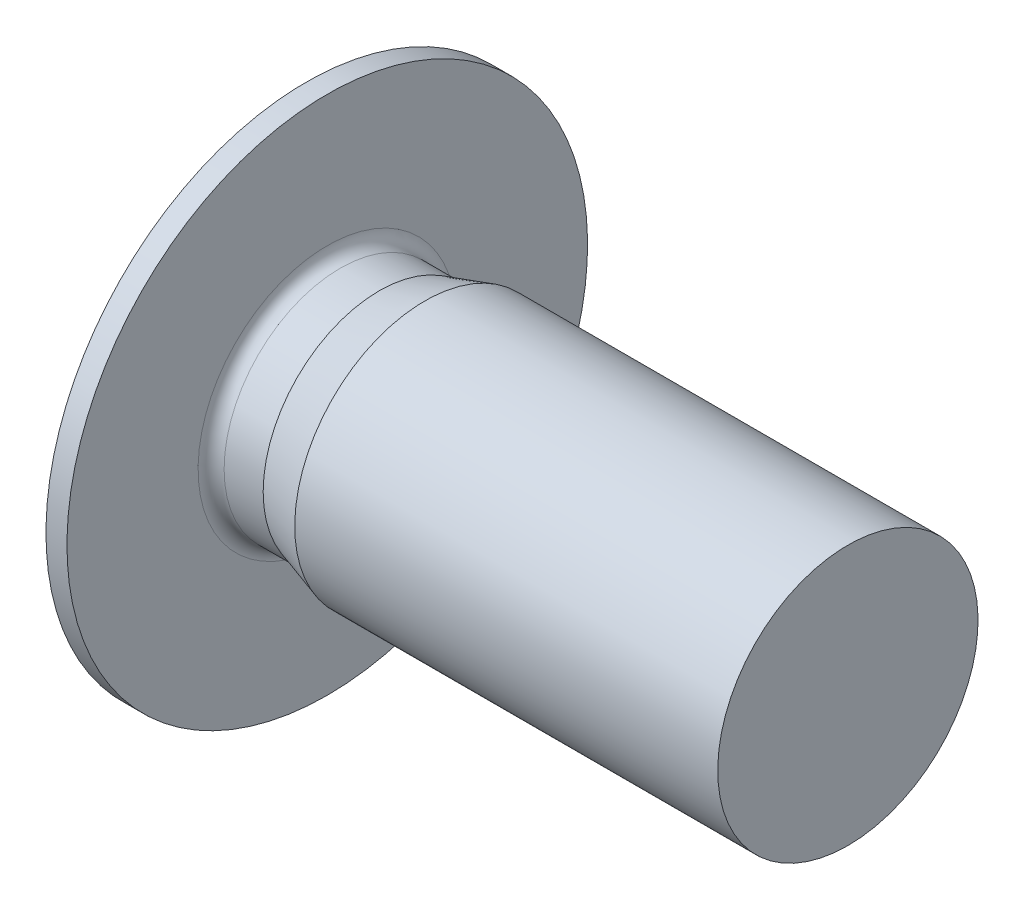
ISO-10303-21;
HEADER;
FILE_DESCRIPTION(('STEP AP214'),'2;1');
FILE_NAME('part.step','',(''),(''),'','','');
FILE_SCHEMA(('AUTOMOTIVE_DESIGN { 1 0 10303 214 1 1 1 1 }'));
ENDSEC;
DATA;
#1=APPLICATION_CONTEXT('core data for automotive mechanical design processes');
#2=APPLICATION_PROTOCOL_DEFINITION('international standard','automotive_design',2000,#1);
#3=PRODUCT_CONTEXT('',#1,'mechanical');
#4=PRODUCT('Part','Part','',(#3));
#5=PRODUCT_RELATED_PRODUCT_CATEGORY('part','',(#4));
#6=PRODUCT_DEFINITION_FORMATION('','',#4);
#7=PRODUCT_DEFINITION_CONTEXT('part definition',#1,'design');
#8=PRODUCT_DEFINITION('design','',#6,#7);
#9=PRODUCT_DEFINITION_SHAPE('','',#8);
#10=(LENGTH_UNIT() NAMED_UNIT(*) SI_UNIT(.MILLI.,.METRE.));
#11=(NAMED_UNIT(*) PLANE_ANGLE_UNIT() SI_UNIT($,.RADIAN.));
#12=(NAMED_UNIT(*) SI_UNIT($,.STERADIAN.) SOLID_ANGLE_UNIT());
#13=UNCERTAINTY_MEASURE_WITH_UNIT(LENGTH_MEASURE(1.E-05),#10,'distance_accuracy_value','');
#14=(GEOMETRIC_REPRESENTATION_CONTEXT(3) GLOBAL_UNCERTAINTY_ASSIGNED_CONTEXT((#13)) GLOBAL_UNIT_ASSIGNED_CONTEXT((#10,
#11,#12)) REPRESENTATION_CONTEXT('',''));
#15=CARTESIAN_POINT('',(0.,0.,0.));
#16=DIRECTION('',(0.,0.,1.));
#17=DIRECTION('',(1.,0.,0.));
#18=AXIS2_PLACEMENT_3D('',#15,#16,#17);
#19=CARTESIAN_POINT('',(1.6,0.,0.));
#20=DIRECTION('',(-1.,0.,0.));
#21=DIRECTION('',(0.,0.,1.));
#22=AXIS2_PLACEMENT_3D('',#19,#20,#21);
#23=PLANE('',#22);
#24=CARTESIAN_POINT('',(1.6,0.,0.));
#25=DIRECTION('',(-1.,0.,0.));
#26=DIRECTION('',(0.,-1.,0.));
#27=AXIS2_PLACEMENT_3D('',#24,#25,#26);
#28=CIRCLE('',#27,1.);
#29=CARTESIAN_POINT('',(1.6,-0.866025403784439,0.5));
#30=VERTEX_POINT('',#29);
#31=CARTESIAN_POINT('',(1.6,0.,1.));
#32=VERTEX_POINT('',#31);
#33=EDGE_CURVE('E55',#30,#32,#28,.T.);
#34=ORIENTED_EDGE('',*,*,#33,.F.);
#35=DIRECTION('',(0.,0.5,0.866025403784439));
#36=VECTOR('',#35,1.);
#37=CARTESIAN_POINT('',(1.6,-1.15470053837925,0.));
#38=LINE('',#37,#36);
#39=CARTESIAN_POINT('',(1.6,-0.577350269189627,1.));
#40=VERTEX_POINT('',#39);
#41=EDGE_CURVE('E270',#30,#40,#38,.T.);
#42=ORIENTED_EDGE('',*,*,#41,.T.);
#43=DIRECTION('',(0.,1.,0.));
#44=VECTOR('',#43,1.);
#45=CARTESIAN_POINT('',(1.6,-0.577350269189627,1.));
#46=LINE('',#45,#44);
#47=EDGE_CURVE('E238',#40,#32,#46,.T.);
#48=ORIENTED_EDGE('',*,*,#47,.T.);
#49=EDGE_LOOP('',(#34,#42,#48));
#50=FACE_BOUND('',#49,.T.);
#51=ADVANCED_FACE('F44',(#50),#23,.T.);
#52=CARTESIAN_POINT('',(1.6,0.866025403784439,0.5));
#53=VERTEX_POINT('',#52);
#54=EDGE_CURVE('E11',#32,#53,#28,.T.);
#55=ORIENTED_EDGE('',*,*,#54,.F.);
#56=CARTESIAN_POINT('',(1.6,0.577350269189626,1.));
#57=VERTEX_POINT('',#56);
#58=EDGE_CURVE('E263',#32,#57,#46,.T.);
#59=ORIENTED_EDGE('',*,*,#58,.T.);
#60=DIRECTION('',(0.,0.5,-0.866025403784439));
#61=VECTOR('',#60,1.);
#62=CARTESIAN_POINT('',(1.6,0.577350269189626,1.));
#63=LINE('',#62,#61);
#64=EDGE_CURVE('E284',#57,#53,#63,.T.);
#65=ORIENTED_EDGE('',*,*,#64,.T.);
#66=EDGE_LOOP('',(#55,#59,#65));
#67=FACE_BOUND('',#66,.T.);
#68=ADVANCED_FACE('F131',(#67),#23,.T.);
#69=CARTESIAN_POINT('',(1.6,0.866025403784439,-0.5));
#70=VERTEX_POINT('',#69);
#71=EDGE_CURVE('E53',#53,#70,#28,.T.);
#72=ORIENTED_EDGE('',*,*,#71,.F.);
#73=CARTESIAN_POINT('',(1.6,1.15470053837925,0.));
#74=VERTEX_POINT('',#73);
#75=EDGE_CURVE('E251',#53,#74,#63,.T.);
#76=ORIENTED_EDGE('',*,*,#75,.T.);
#77=DIRECTION('',(0.,-0.5,-0.866025403784439));
#78=VECTOR('',#77,1.);
#79=CARTESIAN_POINT('',(1.6,1.15470053837925,0.));
#80=LINE('',#79,#78);
#81=EDGE_CURVE('E281',#74,#70,#80,.T.);
#82=ORIENTED_EDGE('',*,*,#81,.T.);
#83=EDGE_LOOP('',(#72,#76,#82));
#84=FACE_BOUND('',#83,.T.);
#85=ADVANCED_FACE('F136',(#84),#23,.T.);
#86=CARTESIAN_POINT('',(1.6,0.,-1.));
#87=VERTEX_POINT('',#86);
#88=EDGE_CURVE('E229',#70,#87,#28,.T.);
#89=ORIENTED_EDGE('',*,*,#88,.F.);
#90=CARTESIAN_POINT('',(1.6,0.577350269189626,-1.));
#91=VERTEX_POINT('',#90);
#92=EDGE_CURVE('E283',#70,#91,#80,.T.);
#93=ORIENTED_EDGE('',*,*,#92,.T.);
#94=DIRECTION('',(0.,-1.,0.));
#95=VECTOR('',#94,1.);
#96=CARTESIAN_POINT('',(1.6,0.577350269189626,-1.));
#97=LINE('',#96,#95);
#98=EDGE_CURVE('E277',#91,#87,#97,.T.);
#99=ORIENTED_EDGE('',*,*,#98,.T.);
#100=EDGE_LOOP('',(#89,#93,#99));
#101=FACE_BOUND('',#100,.T.);
#102=ADVANCED_FACE('F195',(#101),#23,.T.);
#103=CARTESIAN_POINT('',(1.6,-0.866025403784439,-0.5));
#104=VERTEX_POINT('',#103);
#105=EDGE_CURVE('E62',#87,#104,#28,.T.);
#106=ORIENTED_EDGE('',*,*,#105,.F.);
#107=CARTESIAN_POINT('',(1.6,-0.577350269189626,-1.));
#108=VERTEX_POINT('',#107);
#109=EDGE_CURVE('E280',#87,#108,#97,.T.);
#110=ORIENTED_EDGE('',*,*,#109,.T.);
#111=DIRECTION('',(0.,-0.5,0.866025403784438));
#112=VECTOR('',#111,1.);
#113=CARTESIAN_POINT('',(1.6,-0.577350269189626,-1.));
#114=LINE('',#113,#112);
#115=EDGE_CURVE('E272',#108,#104,#114,.T.);
#116=ORIENTED_EDGE('',*,*,#115,.T.);
#117=EDGE_LOOP('',(#106,#110,#116));
#118=FACE_BOUND('',#117,.T.);
#119=ADVANCED_FACE('F129',(#118),#23,.T.);
#120=CARTESIAN_POINT('',(-0.9,0.,0.));
#121=DIRECTION('',(-1.,0.,0.));
#122=DIRECTION('',(0.,-1.,0.));
#123=AXIS2_PLACEMENT_3D('',#120,#121,#122);
#124=CYLINDRICAL_SURFACE('',#123,1.785);
#125=CARTESIAN_POINT('',(0.2,0.,0.));
#126=DIRECTION('',(-1.,0.,0.));
#127=DIRECTION('',(0.,-1.,0.));
#128=AXIS2_PLACEMENT_3D('',#125,#126,#127);
#129=CIRCLE('',#128,1.785);
#130=CARTESIAN_POINT('',(0.2,-1.785,0.));
#131=VERTEX_POINT('',#130);
#132=EDGE_CURVE('E48',#131,#131,#129,.F.);
#133=ORIENTED_EDGE('',*,*,#132,.T.);
#134=EDGE_LOOP('',(#133));
#135=FACE_BOUND('',#134,.T.);
#136=CARTESIAN_POINT('',(0.8,0.,0.));
#137=DIRECTION('',(-1.,0.,0.));
#138=DIRECTION('',(0.,-1.,0.));
#139=AXIS2_PLACEMENT_3D('',#136,#137,#138);
#140=CIRCLE('',#139,1.785);
#141=CARTESIAN_POINT('',(0.8,-1.785,0.));
#142=VERTEX_POINT('',#141);
#143=EDGE_CURVE('E202',#142,#142,#140,.T.);
#144=ORIENTED_EDGE('',*,*,#143,.T.);
#145=EDGE_LOOP('',(#144));
#146=FACE_BOUND('',#145,.T.);
#147=ADVANCED_FACE('F188',(#135,#146),#124,.T.);
#148=CARTESIAN_POINT('',(0.,4.,0.));
#149=DIRECTION('',(-1.,0.,0.));
#150=DIRECTION('',(0.,-1.,0.));
#151=AXIS2_PLACEMENT_3D('',#148,#149,#150);
#152=PLANE('',#151);
#153=CARTESIAN_POINT('',(0.,0.,0.));
#154=DIRECTION('',(-1.,0.,0.));
#155=DIRECTION('',(0.,-1.,0.));
#156=AXIS2_PLACEMENT_3D('',#153,#154,#155);
#157=CIRCLE('',#156,1.985);
#158=CARTESIAN_POINT('',(0.,-1.985,0.));
#159=VERTEX_POINT('',#158);
#160=EDGE_CURVE('E225',#159,#159,#157,.T.);
#161=ORIENTED_EDGE('',*,*,#160,.T.);
#162=EDGE_LOOP('',(#161));
#163=FACE_BOUND('',#162,.T.);
#164=CARTESIAN_POINT('',(0.,0.,0.));
#165=DIRECTION('',(-1.,0.,0.));
#166=DIRECTION('',(0.,-1.,0.));
#167=AXIS2_PLACEMENT_3D('',#164,#165,#166);
#168=CIRCLE('',#167,4.);
#169=CARTESIAN_POINT('',(0.,-4.,0.));
#170=VERTEX_POINT('',#169);
#171=EDGE_CURVE('E223',#170,#170,#168,.T.);
#172=ORIENTED_EDGE('',*,*,#171,.F.);
#173=EDGE_LOOP('',(#172));
#174=FACE_BOUND('',#173,.T.);
#175=ADVANCED_FACE('F185',(#163,#174),#152,.F.);
#176=CARTESIAN_POINT('',(-0.9,0.,0.));
#177=DIRECTION('',(-1.,0.,0.));
#178=DIRECTION('',(0.,-1.,0.));
#179=AXIS2_PLACEMENT_3D('',#176,#177,#178);
#180=CYLINDRICAL_SURFACE('',#179,4.);
#181=CARTESIAN_POINT('',(-0.322649730810382,0.,0.));
#182=DIRECTION('',(-1.,0.,0.));
#183=DIRECTION('',(0.,-1.,0.));
#184=AXIS2_PLACEMENT_3D('',#181,#182,#183);
#185=CIRCLE('',#184,4.);
#186=CARTESIAN_POINT('',(-0.322649730810381,-4.,0.));
#187=VERTEX_POINT('',#186);
#188=EDGE_CURVE('E220',#187,#187,#185,.T.);
#189=ORIENTED_EDGE('',*,*,#188,.F.);
#190=EDGE_LOOP('',(#189));
#191=FACE_BOUND('',#190,.T.);
#192=ORIENTED_EDGE('',*,*,#171,.T.);
#193=EDGE_LOOP('',(#192));
#194=FACE_BOUND('',#193,.T.);
#195=ADVANCED_FACE('F181',(#191,#194),#180,.T.);
#196=CARTESIAN_POINT('',(-0.322649730810382,0.,0.));
#197=DIRECTION('',(1.,0.,0.));
#198=DIRECTION('',(0.,1.,0.));
#199=AXIS2_PLACEMENT_3D('',#196,#197,#198);
#200=CONICAL_SURFACE('',#199,4.,1.0471975511966);
#201=CARTESIAN_POINT('',(-0.9,0.,0.));
#202=DIRECTION('',(-1.,0.,0.));
#203=DIRECTION('',(0.,-1.,0.));
#204=AXIS2_PLACEMENT_3D('',#201,#202,#203);
#205=CIRCLE('',#204,3.);
#206=CARTESIAN_POINT('',(-0.9,-3.,0.));
#207=VERTEX_POINT('',#206);
#208=EDGE_CURVE('E217',#207,#207,#205,.T.);
#209=ORIENTED_EDGE('',*,*,#208,.F.);
#210=EDGE_LOOP('',(#209));
#211=FACE_BOUND('',#210,.T.);
#212=ORIENTED_EDGE('',*,*,#188,.T.);
#213=EDGE_LOOP('',(#212));
#214=FACE_BOUND('',#213,.T.);
#215=ADVANCED_FACE('F177',(#211,#214),#200,.T.);
#216=CARTESIAN_POINT('',(-0.9,0.,0.));
#217=DIRECTION('',(1.,0.,0.));
#218=DIRECTION('',(0.,1.,0.));
#219=AXIS2_PLACEMENT_3D('',#216,#217,#218);
#220=PLANE('',#219);
#221=DIRECTION('',(0.,-0.5,-0.866025403784439));
#222=VECTOR('',#221,1.);
#223=CARTESIAN_POINT('',(-0.9,1.15470053837925,0.));
#224=LINE('',#223,#222);
#225=CARTESIAN_POINT('',(-0.9,1.15470053837925,0.));
#226=VERTEX_POINT('',#225);
#227=CARTESIAN_POINT('',(-0.9,0.577350269189626,-1.));
#228=VERTEX_POINT('',#227);
#229=EDGE_CURVE('E232',#226,#228,#224,.T.);
#230=ORIENTED_EDGE('',*,*,#229,.F.);
#231=DIRECTION('',(0.,0.5,-0.866025403784439));
#232=VECTOR('',#231,1.);
#233=CARTESIAN_POINT('',(-0.9,0.577350269189626,1.));
#234=LINE('',#233,#232);
#235=CARTESIAN_POINT('',(-0.9,0.577350269189626,1.));
#236=VERTEX_POINT('',#235);
#237=EDGE_CURVE('E70',#236,#226,#234,.T.);
#238=ORIENTED_EDGE('',*,*,#237,.F.);
#239=DIRECTION('',(0.,1.,0.));
#240=VECTOR('',#239,1.);
#241=CARTESIAN_POINT('',(-0.9,-0.577350269189627,1.));
#242=LINE('',#241,#240);
#243=CARTESIAN_POINT('',(-0.9,-0.577350269189627,1.));
#244=VERTEX_POINT('',#243);
#245=EDGE_CURVE('E249',#244,#236,#242,.T.);
#246=ORIENTED_EDGE('',*,*,#245,.F.);
#247=DIRECTION('',(0.,0.5,0.866025403784439));
#248=VECTOR('',#247,1.);
#249=CARTESIAN_POINT('',(-0.9,-1.15470053837925,0.));
#250=LINE('',#249,#248);
#251=CARTESIAN_POINT('',(-0.9,-1.15470053837925,0.));
#252=VERTEX_POINT('',#251);
#253=EDGE_CURVE('E246',#252,#244,#250,.T.);
#254=ORIENTED_EDGE('',*,*,#253,.F.);
#255=DIRECTION('',(0.,-0.5,0.866025403784438));
#256=VECTOR('',#255,1.);
#257=CARTESIAN_POINT('',(-0.9,-0.577350269189626,-1.));
#258=LINE('',#257,#256);
#259=CARTESIAN_POINT('',(-0.9,-0.577350269189626,-1.));
#260=VERTEX_POINT('',#259);
#261=EDGE_CURVE('E243',#260,#252,#258,.T.);
#262=ORIENTED_EDGE('',*,*,#261,.F.);
#263=DIRECTION('',(0.,-1.,0.));
#264=VECTOR('',#263,1.);
#265=CARTESIAN_POINT('',(-0.9,0.577350269189626,-1.));
#266=LINE('',#265,#264);
#267=EDGE_CURVE('E235',#228,#260,#266,.T.);
#268=ORIENTED_EDGE('',*,*,#267,.F.);
#269=EDGE_LOOP('',(#230,#238,#246,#254,#262,#268));
#270=FACE_BOUND('',#269,.T.);
#271=ORIENTED_EDGE('',*,*,#208,.T.);
#272=EDGE_LOOP('',(#271));
#273=FACE_BOUND('',#272,.T.);
#274=ADVANCED_FACE('F173',(#270,#273),#220,.F.);
#275=CARTESIAN_POINT('',(8.,2.,0.));
#276=DIRECTION('',(-1.,0.,0.));
#277=DIRECTION('',(0.,-1.,0.));
#278=AXIS2_PLACEMENT_3D('',#275,#276,#277);
#279=PLANE('',#278);
#280=CARTESIAN_POINT('',(8.,0.,0.));
#281=DIRECTION('',(-1.,0.,0.));
#282=DIRECTION('',(0.,-1.,0.));
#283=AXIS2_PLACEMENT_3D('',#280,#281,#282);
#284=CIRCLE('',#283,2.);
#285=CARTESIAN_POINT('',(8.,-2.,0.));
#286=VERTEX_POINT('',#285);
#287=EDGE_CURVE('E207',#286,#286,#284,.T.);
#288=ORIENTED_EDGE('',*,*,#287,.F.);
#289=EDGE_LOOP('',(#288));
#290=FACE_BOUND('',#289,.T.);
#291=ADVANCED_FACE('F169',(#290),#279,.F.);
#292=CARTESIAN_POINT('',(-0.9,0.,0.));
#293=DIRECTION('',(-1.,0.,0.));
#294=DIRECTION('',(0.,-1.,0.));
#295=AXIS2_PLACEMENT_3D('',#292,#293,#294);
#296=CYLINDRICAL_SURFACE('',#295,2.);
#297=CARTESIAN_POINT('',(1.5,0.,0.));
#298=DIRECTION('',(-1.,0.,0.));
#299=DIRECTION('',(0.,-1.,0.));
#300=AXIS2_PLACEMENT_3D('',#297,#298,#299);
#301=CIRCLE('',#300,2.);
#302=CARTESIAN_POINT('',(1.5,-2.,0.));
#303=VERTEX_POINT('',#302);
#304=EDGE_CURVE('E203',#303,#303,#301,.T.);
#305=ORIENTED_EDGE('',*,*,#304,.F.);
#306=EDGE_LOOP('',(#305));
#307=FACE_BOUND('',#306,.T.);
#308=ORIENTED_EDGE('',*,*,#287,.T.);
#309=EDGE_LOOP('',(#308));
#310=FACE_BOUND('',#309,.T.);
#311=ADVANCED_FACE('F165',(#307,#310),#296,.T.);
#312=CARTESIAN_POINT('',(1.5,0.,0.));
#313=DIRECTION('',(1.,0.,0.));
#314=DIRECTION('',(0.,1.,0.));
#315=AXIS2_PLACEMENT_3D('',#312,#313,#314);
#316=CONICAL_SURFACE('',#315,2.,0.297996923596222);
#317=ORIENTED_EDGE('',*,*,#143,.F.);
#318=EDGE_LOOP('',(#317));
#319=FACE_BOUND('',#318,.T.);
#320=ORIENTED_EDGE('',*,*,#304,.T.);
#321=EDGE_LOOP('',(#320));
#322=FACE_BOUND('',#321,.T.);
#323=ADVANCED_FACE('F162',(#319,#322),#316,.T.);
#324=CARTESIAN_POINT('',(0.2,0.,0.));
#325=DIRECTION('',(-1.,0.,0.));
#326=DIRECTION('',(0.,-1.,0.));
#327=AXIS2_PLACEMENT_3D('',#324,#325,#326);
#328=TOROIDAL_SURFACE('',#327,1.985,0.2);
#329=ORIENTED_EDGE('',*,*,#132,.F.);
#330=EDGE_LOOP('',(#329));
#331=FACE_BOUND('',#330,.T.);
#332=ORIENTED_EDGE('',*,*,#160,.F.);
#333=EDGE_LOOP('',(#332));
#334=FACE_BOUND('',#333,.T.);
#335=ADVANCED_FACE('F46',(#331,#334),#328,.F.);
#336=CARTESIAN_POINT('',(1.6,0.577350269189626,1.));
#337=DIRECTION('',(0.,0.866025403784439,0.5));
#338=DIRECTION('',(0.,-0.5,0.866025403784439));
#339=AXIS2_PLACEMENT_3D('',#336,#337,#338);
#340=PLANE('',#339);
#341=ORIENTED_EDGE('',*,*,#237,.T.);
#342=DIRECTION('',(-1.,0.,0.));
#343=VECTOR('',#342,1.);
#344=CARTESIAN_POINT('',(1.6,1.15470053837925,0.));
#345=LINE('',#344,#343);
#346=EDGE_CURVE('E212',#74,#226,#345,.T.);
#347=ORIENTED_EDGE('',*,*,#346,.F.);
#348=ORIENTED_EDGE('',*,*,#75,.F.);
#349=ORIENTED_EDGE('',*,*,#64,.F.);
#350=DIRECTION('',(-1.,0.,0.));
#351=VECTOR('',#350,1.);
#352=CARTESIAN_POINT('',(1.6,0.577350269189626,1.));
#353=LINE('',#352,#351);
#354=EDGE_CURVE('E204',#57,#236,#353,.T.);
#355=ORIENTED_EDGE('',*,*,#354,.T.);
#356=EDGE_LOOP('',(#341,#347,#348,#349,#355));
#357=FACE_BOUND('',#356,.T.);
#358=ADVANCED_FACE('F144',(#357),#340,.F.);
#359=CARTESIAN_POINT('',(1.6,-0.577350269189627,1.));
#360=DIRECTION('',(0.,0.,1.));
#361=DIRECTION('',(1.,0.,0.));
#362=AXIS2_PLACEMENT_3D('',#359,#360,#361);
#363=PLANE('',#362);
#364=ORIENTED_EDGE('',*,*,#245,.T.);
#365=ORIENTED_EDGE('',*,*,#354,.F.);
#366=ORIENTED_EDGE('',*,*,#58,.F.);
#367=ORIENTED_EDGE('',*,*,#47,.F.);
#368=DIRECTION('',(-1.,0.,0.));
#369=VECTOR('',#368,1.);
#370=CARTESIAN_POINT('',(1.6,-0.577350269189627,1.));
#371=LINE('',#370,#369);
#372=EDGE_CURVE('E209',#40,#244,#371,.T.);
#373=ORIENTED_EDGE('',*,*,#372,.T.);
#374=EDGE_LOOP('',(#364,#365,#366,#367,#373));
#375=FACE_BOUND('',#374,.T.);
#376=ADVANCED_FACE('F140',(#375),#363,.F.);
#377=CARTESIAN_POINT('',(1.6,-1.15470053837925,0.));
#378=DIRECTION('',(0.,-0.866025403784439,0.5));
#379=DIRECTION('',(0.,-0.5,-0.866025403784439));
#380=AXIS2_PLACEMENT_3D('',#377,#378,#379);
#381=PLANE('',#380);
#382=ORIENTED_EDGE('',*,*,#253,.T.);
#383=ORIENTED_EDGE('',*,*,#372,.F.);
#384=ORIENTED_EDGE('',*,*,#41,.F.);
#385=CARTESIAN_POINT('',(1.6,-1.15470053837925,0.));
#386=VERTEX_POINT('',#385);
#387=EDGE_CURVE('E265',#386,#30,#38,.T.);
#388=ORIENTED_EDGE('',*,*,#387,.F.);
#389=DIRECTION('',(-1.,0.,0.));
#390=VECTOR('',#389,1.);
#391=CARTESIAN_POINT('',(1.6,-1.15470053837925,0.));
#392=LINE('',#391,#390);
#393=EDGE_CURVE('E254',#386,#252,#392,.T.);
#394=ORIENTED_EDGE('',*,*,#393,.T.);
#395=EDGE_LOOP('',(#382,#383,#384,#388,#394));
#396=FACE_BOUND('',#395,.T.);
#397=ADVANCED_FACE('F143',(#396),#381,.F.);
#398=CARTESIAN_POINT('',(1.6,-0.577350269189626,-1.));
#399=DIRECTION('',(0.,-0.866025403784439,-0.5));
#400=DIRECTION('',(0.,0.5,-0.866025403784439));
#401=AXIS2_PLACEMENT_3D('',#398,#399,#400);
#402=PLANE('',#401);
#403=ORIENTED_EDGE('',*,*,#261,.T.);
#404=ORIENTED_EDGE('',*,*,#393,.F.);
#405=EDGE_CURVE('E276',#104,#386,#114,.T.);
#406=ORIENTED_EDGE('',*,*,#405,.F.);
#407=ORIENTED_EDGE('',*,*,#115,.F.);
#408=DIRECTION('',(-1.,0.,0.));
#409=VECTOR('',#408,1.);
#410=CARTESIAN_POINT('',(1.6,-0.577350269189626,-1.));
#411=LINE('',#410,#409);
#412=EDGE_CURVE('E256',#108,#260,#411,.T.);
#413=ORIENTED_EDGE('',*,*,#412,.T.);
#414=EDGE_LOOP('',(#403,#404,#406,#407,#413));
#415=FACE_BOUND('',#414,.T.);
#416=ADVANCED_FACE('F148',(#415),#402,.F.);
#417=CARTESIAN_POINT('',(1.6,0.577350269189626,-1.));
#418=DIRECTION('',(0.,0.,-1.));
#419=DIRECTION('',(-1.,0.,0.));
#420=AXIS2_PLACEMENT_3D('',#417,#418,#419);
#421=PLANE('',#420);
#422=ORIENTED_EDGE('',*,*,#267,.T.);
#423=ORIENTED_EDGE('',*,*,#412,.F.);
#424=ORIENTED_EDGE('',*,*,#109,.F.);
#425=ORIENTED_EDGE('',*,*,#98,.F.);
#426=DIRECTION('',(-1.,0.,0.));
#427=VECTOR('',#426,1.);
#428=CARTESIAN_POINT('',(1.6,0.577350269189626,-1.));
#429=LINE('',#428,#427);
#430=EDGE_CURVE('E257',#91,#228,#429,.T.);
#431=ORIENTED_EDGE('',*,*,#430,.T.);
#432=EDGE_LOOP('',(#422,#423,#424,#425,#431));
#433=FACE_BOUND('',#432,.T.);
#434=ADVANCED_FACE('F152',(#433),#421,.F.);
#435=CARTESIAN_POINT('',(1.6,1.15470053837925,0.));
#436=DIRECTION('',(0.,0.866025403784439,-0.5));
#437=DIRECTION('',(0.,0.5,0.866025403784439));
#438=AXIS2_PLACEMENT_3D('',#435,#436,#437);
#439=PLANE('',#438);
#440=ORIENTED_EDGE('',*,*,#229,.T.);
#441=ORIENTED_EDGE('',*,*,#430,.F.);
#442=ORIENTED_EDGE('',*,*,#92,.F.);
#443=ORIENTED_EDGE('',*,*,#81,.F.);
#444=ORIENTED_EDGE('',*,*,#346,.T.);
#445=EDGE_LOOP('',(#440,#441,#442,#443,#444));
#446=FACE_BOUND('',#445,.T.);
#447=ADVANCED_FACE('F126',(#446),#439,.F.);
#448=EDGE_CURVE('E228',#104,#30,#28,.T.);
#449=ORIENTED_EDGE('',*,*,#448,.F.);
#450=ORIENTED_EDGE('',*,*,#405,.T.);
#451=ORIENTED_EDGE('',*,*,#387,.T.);
#452=EDGE_LOOP('',(#449,#450,#451));
#453=FACE_BOUND('',#452,.T.);
#454=ADVANCED_FACE('F121',(#453),#23,.T.);
#455=CARTESIAN_POINT('',(2.20086061902756,0.,0.));
#456=DIRECTION('',(-1.,0.,0.));
#457=DIRECTION('',(0.,-1.,0.));
#458=AXIS2_PLACEMENT_3D('',#455,#456,#457);
#459=CONICAL_SURFACE('',#458,0.,1.02974425867666);
#460=ORIENTED_EDGE('',*,*,#33,.T.);
#461=ORIENTED_EDGE('',*,*,#54,.T.);
#462=ORIENTED_EDGE('',*,*,#71,.T.);
#463=ORIENTED_EDGE('',*,*,#88,.T.);
#464=ORIENTED_EDGE('',*,*,#105,.T.);
#465=ORIENTED_EDGE('',*,*,#448,.T.);
#466=EDGE_LOOP('',(#460,#461,#462,#463,#464,#465));
#467=FACE_BOUND('',#466,.T.);
#468=CARTESIAN_POINT('',(2.20086061902756,0.,0.));
#469=VERTEX_POINT('',#468);
#470=VERTEX_LOOP('',#469);
#471=FACE_BOUND('',#470,.T.);
#472=ADVANCED_FACE('F119',(#467,#471),#459,.F.);
#473=CLOSED_SHELL('',(#51,#68,#85,#102,#119,#147,#175,#195,#215,#274,#291,#311,#323,#335,#358,
#376,#397,#416,#434,#447,#454,#472));
#474=MANIFOLD_SOLID_BREP('B2',#473);
#475=ADVANCED_BREP_SHAPE_REPRESENTATION('',(#18,#474),#14);
#476=SHAPE_DEFINITION_REPRESENTATION(#9,#475);
ENDSEC;
END-ISO-10303-21;
